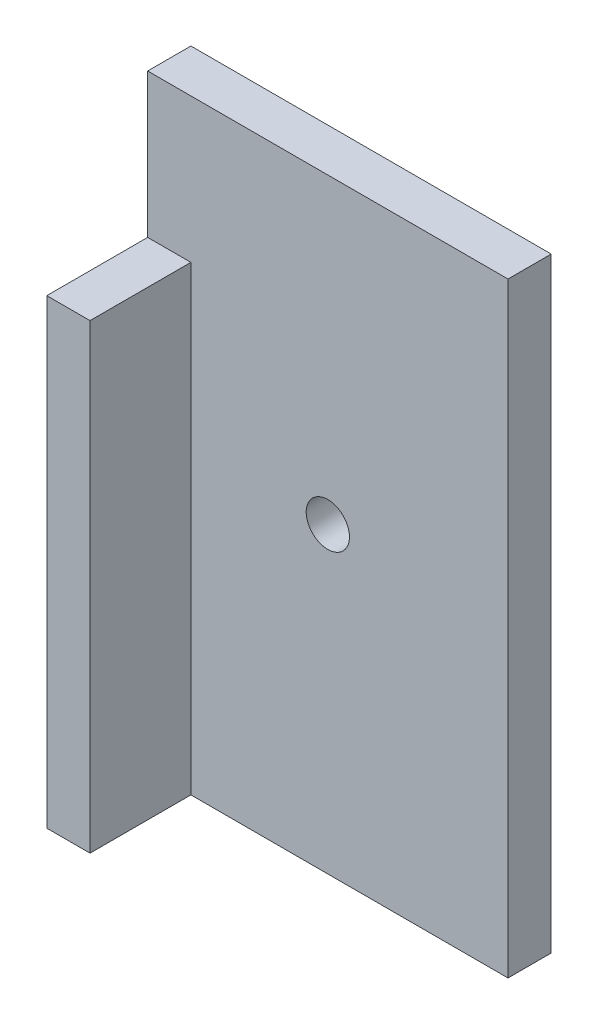
ISO-10303-21;
HEADER;
FILE_DESCRIPTION(('STEP AP214'),'2;1');
FILE_NAME('part.step','',(''),(''),'','','');
FILE_SCHEMA(('AUTOMOTIVE_DESIGN { 1 0 10303 214 1 1 1 1 }'));
ENDSEC;
DATA;
#1=APPLICATION_CONTEXT('core data for automotive mechanical design processes');
#2=APPLICATION_PROTOCOL_DEFINITION('international standard','automotive_design',2000,#1);
#3=PRODUCT_CONTEXT('',#1,'mechanical');
#4=PRODUCT('Part','Part','',(#3));
#5=PRODUCT_RELATED_PRODUCT_CATEGORY('part','',(#4));
#6=PRODUCT_DEFINITION_FORMATION('','',#4);
#7=PRODUCT_DEFINITION_CONTEXT('part definition',#1,'design');
#8=PRODUCT_DEFINITION('design','',#6,#7);
#9=PRODUCT_DEFINITION_SHAPE('','',#8);
#10=(LENGTH_UNIT() NAMED_UNIT(*) SI_UNIT(.MILLI.,.METRE.));
#11=(NAMED_UNIT(*) PLANE_ANGLE_UNIT() SI_UNIT($,.RADIAN.));
#12=(NAMED_UNIT(*) SI_UNIT($,.STERADIAN.) SOLID_ANGLE_UNIT());
#13=UNCERTAINTY_MEASURE_WITH_UNIT(LENGTH_MEASURE(1.E-05),#10,'distance_accuracy_value','');
#14=(GEOMETRIC_REPRESENTATION_CONTEXT(3) GLOBAL_UNCERTAINTY_ASSIGNED_CONTEXT((#13)) GLOBAL_UNIT_ASSIGNED_CONTEXT((#10,
#11,#12)) REPRESENTATION_CONTEXT('',''));
#15=CARTESIAN_POINT('',(0.,0.,0.));
#16=DIRECTION('',(0.,0.,1.));
#17=DIRECTION('',(1.,0.,0.));
#18=AXIS2_PLACEMENT_3D('',#15,#16,#17);
#19=CARTESIAN_POINT('',(0.,0.,3.));
#20=DIRECTION('',(0.,0.,1.));
#21=DIRECTION('',(1.,0.,0.));
#22=AXIS2_PLACEMENT_3D('',#19,#20,#21);
#23=PLANE('',#22);
#24=DIRECTION('',(0.,1.,0.));
#25=VECTOR('',#24,1.);
#26=CARTESIAN_POINT('',(-9.5,21.,3.));
#27=LINE('',#26,#25);
#28=CARTESIAN_POINT('',(-9.5,-21.,3.));
#29=VERTEX_POINT('',#28);
#30=CARTESIAN_POINT('',(-9.5,11.,3.));
#31=VERTEX_POINT('',#30);
#32=EDGE_CURVE('E63',#29,#31,#27,.T.);
#33=ORIENTED_EDGE('',*,*,#32,.F.);
#34=DIRECTION('',(1.,0.,0.));
#35=VECTOR('',#34,1.);
#36=CARTESIAN_POINT('',(-12.5,-21.,3.));
#37=LINE('',#36,#35);
#38=CARTESIAN_POINT('',(12.5,-21.,3.));
#39=VERTEX_POINT('',#38);
#40=EDGE_CURVE('E137',#29,#39,#37,.T.);
#41=ORIENTED_EDGE('',*,*,#40,.T.);
#42=DIRECTION('',(0.,1.,0.));
#43=VECTOR('',#42,1.);
#44=CARTESIAN_POINT('',(12.5,21.,3.));
#45=LINE('',#44,#43);
#46=CARTESIAN_POINT('',(12.5,21.,3.));
#47=VERTEX_POINT('',#46);
#48=EDGE_CURVE('E131',#39,#47,#45,.T.);
#49=ORIENTED_EDGE('',*,*,#48,.T.);
#50=DIRECTION('',(-1.,0.,0.));
#51=VECTOR('',#50,1.);
#52=CARTESIAN_POINT('',(-12.5,21.,3.));
#53=LINE('',#52,#51);
#54=CARTESIAN_POINT('',(-12.5,21.,3.));
#55=VERTEX_POINT('',#54);
#56=EDGE_CURVE('E134',#47,#55,#53,.T.);
#57=ORIENTED_EDGE('',*,*,#56,.T.);
#58=DIRECTION('',(0.,1.,0.));
#59=VECTOR('',#58,1.);
#60=CARTESIAN_POINT('',(-12.5,21.,3.));
#61=LINE('',#60,#59);
#62=CARTESIAN_POINT('',(-12.5,11.,3.));
#63=VERTEX_POINT('',#62);
#64=EDGE_CURVE('E123',#63,#55,#61,.T.);
#65=ORIENTED_EDGE('',*,*,#64,.F.);
#66=DIRECTION('',(1.,0.,0.));
#67=VECTOR('',#66,1.);
#68=CARTESIAN_POINT('',(-19.5,11.,3.));
#69=LINE('',#68,#67);
#70=EDGE_CURVE('E109',#63,#31,#69,.T.);
#71=ORIENTED_EDGE('',*,*,#70,.T.);
#72=EDGE_LOOP('',(#33,#41,#49,#57,#65,#71));
#73=FACE_BOUND('',#72,.T.);
#74=CARTESIAN_POINT('',(0.,0.,3.));
#75=DIRECTION('',(0.,0.,1.));
#76=DIRECTION('',(1.,0.,0.));
#77=AXIS2_PLACEMENT_3D('',#74,#75,#76);
#78=CIRCLE('',#77,1.5);
#79=CARTESIAN_POINT('',(1.5,0.,3.));
#80=VERTEX_POINT('',#79);
#81=EDGE_CURVE('E125',#80,#80,#78,.T.);
#82=ORIENTED_EDGE('',*,*,#81,.F.);
#83=EDGE_LOOP('',(#82));
#84=FACE_BOUND('',#83,.T.);
#85=ADVANCED_FACE('F41',(#73,#84),#23,.T.);
#86=CARTESIAN_POINT('',(0.,0.,0.));
#87=DIRECTION('',(0.,0.,1.));
#88=DIRECTION('',(1.,0.,0.));
#89=AXIS2_PLACEMENT_3D('',#86,#87,#88);
#90=PLANE('',#89);
#91=DIRECTION('',(0.,1.,0.));
#92=VECTOR('',#91,1.);
#93=CARTESIAN_POINT('',(12.5,21.,0.));
#94=LINE('',#93,#92);
#95=CARTESIAN_POINT('',(12.5,-21.,0.));
#96=VERTEX_POINT('',#95);
#97=CARTESIAN_POINT('',(12.5,21.,0.));
#98=VERTEX_POINT('',#97);
#99=EDGE_CURVE('E128',#96,#98,#94,.T.);
#100=ORIENTED_EDGE('',*,*,#99,.F.);
#101=DIRECTION('',(1.,0.,0.));
#102=VECTOR('',#101,1.);
#103=CARTESIAN_POINT('',(-12.5,-21.,0.));
#104=LINE('',#103,#102);
#105=CARTESIAN_POINT('',(-12.5,-21.,0.));
#106=VERTEX_POINT('',#105);
#107=EDGE_CURVE('E135',#106,#96,#104,.T.);
#108=ORIENTED_EDGE('',*,*,#107,.F.);
#109=DIRECTION('',(0.,-1.,0.));
#110=VECTOR('',#109,1.);
#111=CARTESIAN_POINT('',(-12.5,21.,0.));
#112=LINE('',#111,#110);
#113=CARTESIAN_POINT('',(-12.5,21.,0.));
#114=VERTEX_POINT('',#113);
#115=EDGE_CURVE('E145',#114,#106,#112,.T.);
#116=ORIENTED_EDGE('',*,*,#115,.F.);
#117=DIRECTION('',(-1.,0.,0.));
#118=VECTOR('',#117,1.);
#119=CARTESIAN_POINT('',(-12.5,21.,0.));
#120=LINE('',#119,#118);
#121=EDGE_CURVE('E142',#98,#114,#120,.T.);
#122=ORIENTED_EDGE('',*,*,#121,.F.);
#123=EDGE_LOOP('',(#100,#108,#116,#122));
#124=FACE_BOUND('',#123,.T.);
#125=CARTESIAN_POINT('',(0.,0.,0.));
#126=DIRECTION('',(0.,0.,1.));
#127=DIRECTION('',(1.,0.,0.));
#128=AXIS2_PLACEMENT_3D('',#125,#126,#127);
#129=CIRCLE('',#128,1.5);
#130=CARTESIAN_POINT('',(1.5,0.,0.));
#131=VERTEX_POINT('',#130);
#132=EDGE_CURVE('E117',#131,#131,#129,.T.);
#133=ORIENTED_EDGE('',*,*,#132,.T.);
#134=EDGE_LOOP('',(#133));
#135=FACE_BOUND('',#134,.T.);
#136=ADVANCED_FACE('F166',(#124,#135),#90,.F.);
#137=CARTESIAN_POINT('',(12.5,21.,3.));
#138=DIRECTION('',(-1.,0.,0.));
#139=DIRECTION('',(0.,-1.,0.));
#140=AXIS2_PLACEMENT_3D('',#137,#138,#139);
#141=PLANE('',#140);
#142=ORIENTED_EDGE('',*,*,#99,.T.);
#143=DIRECTION('',(0.,0.,-1.));
#144=VECTOR('',#143,1.);
#145=CARTESIAN_POINT('',(12.5,21.,3.));
#146=LINE('',#145,#144);
#147=EDGE_CURVE('E49',#47,#98,#146,.T.);
#148=ORIENTED_EDGE('',*,*,#147,.F.);
#149=ORIENTED_EDGE('',*,*,#48,.F.);
#150=DIRECTION('',(0.,0.,-1.));
#151=VECTOR('',#150,1.);
#152=CARTESIAN_POINT('',(12.5,-21.,3.));
#153=LINE('',#152,#151);
#154=EDGE_CURVE('E139',#39,#96,#153,.T.);
#155=ORIENTED_EDGE('',*,*,#154,.T.);
#156=EDGE_LOOP('',(#142,#148,#149,#155));
#157=FACE_BOUND('',#156,.T.);
#158=ADVANCED_FACE('F43',(#157),#141,.F.);
#159=CARTESIAN_POINT('',(-12.5,21.,3.));
#160=DIRECTION('',(0.,-1.,0.));
#161=DIRECTION('',(0.,0.,-1.));
#162=AXIS2_PLACEMENT_3D('',#159,#160,#161);
#163=PLANE('',#162);
#164=DIRECTION('',(0.,0.,-1.));
#165=VECTOR('',#164,1.);
#166=CARTESIAN_POINT('',(-12.5,21.,3.));
#167=LINE('',#166,#165);
#168=EDGE_CURVE('E153',#55,#114,#167,.T.);
#169=ORIENTED_EDGE('',*,*,#168,.F.);
#170=ORIENTED_EDGE('',*,*,#56,.F.);
#171=ORIENTED_EDGE('',*,*,#147,.T.);
#172=ORIENTED_EDGE('',*,*,#121,.T.);
#173=EDGE_LOOP('',(#169,#170,#171,#172));
#174=FACE_BOUND('',#173,.T.);
#175=ADVANCED_FACE('F158',(#174),#163,.F.);
#176=CARTESIAN_POINT('',(-12.5,21.,3.));
#177=DIRECTION('',(1.,0.,0.));
#178=DIRECTION('',(0.,0.,-1.));
#179=AXIS2_PLACEMENT_3D('',#176,#177,#178);
#180=PLANE('',#179);
#181=DIRECTION('',(0.,0.,-1.));
#182=VECTOR('',#181,1.);
#183=CARTESIAN_POINT('',(-12.5,11.,3.));
#184=LINE('',#183,#182);
#185=CARTESIAN_POINT('',(-12.5,11.,10.));
#186=VERTEX_POINT('',#185);
#187=EDGE_CURVE('E55',#186,#63,#184,.T.);
#188=ORIENTED_EDGE('',*,*,#187,.T.);
#189=ORIENTED_EDGE('',*,*,#64,.T.);
#190=ORIENTED_EDGE('',*,*,#168,.T.);
#191=ORIENTED_EDGE('',*,*,#115,.T.);
#192=DIRECTION('',(0.,0.,-1.));
#193=VECTOR('',#192,1.);
#194=CARTESIAN_POINT('',(-12.5,-21.,3.));
#195=LINE('',#194,#193);
#196=CARTESIAN_POINT('',(-12.5,-21.,10.));
#197=VERTEX_POINT('',#196);
#198=EDGE_CURVE('E150',#197,#106,#195,.T.);
#199=ORIENTED_EDGE('',*,*,#198,.F.);
#200=DIRECTION('',(0.,-1.,0.));
#201=VECTOR('',#200,1.);
#202=CARTESIAN_POINT('',(-12.5,21.,10.));
#203=LINE('',#202,#201);
#204=EDGE_CURVE('E119',#186,#197,#203,.T.);
#205=ORIENTED_EDGE('',*,*,#204,.F.);
#206=EDGE_LOOP('',(#188,#189,#190,#191,#199,#205));
#207=FACE_BOUND('',#206,.T.);
#208=ADVANCED_FACE('F170',(#207),#180,.F.);
#209=CARTESIAN_POINT('',(-12.5,-21.,3.));
#210=DIRECTION('',(0.,1.,0.));
#211=DIRECTION('',(0.,0.,1.));
#212=AXIS2_PLACEMENT_3D('',#209,#210,#211);
#213=PLANE('',#212);
#214=ORIENTED_EDGE('',*,*,#107,.T.);
#215=ORIENTED_EDGE('',*,*,#154,.F.);
#216=ORIENTED_EDGE('',*,*,#40,.F.);
#217=DIRECTION('',(0.,0.,-1.));
#218=VECTOR('',#217,1.);
#219=CARTESIAN_POINT('',(-9.5,-21.,10.));
#220=LINE('',#219,#218);
#221=CARTESIAN_POINT('',(-9.5,-21.,10.));
#222=VERTEX_POINT('',#221);
#223=EDGE_CURVE('E115',#222,#29,#220,.T.);
#224=ORIENTED_EDGE('',*,*,#223,.F.);
#225=DIRECTION('',(1.,0.,0.));
#226=VECTOR('',#225,1.);
#227=CARTESIAN_POINT('',(-12.5,-21.,10.));
#228=LINE('',#227,#226);
#229=EDGE_CURVE('E113',#197,#222,#228,.T.);
#230=ORIENTED_EDGE('',*,*,#229,.F.);
#231=ORIENTED_EDGE('',*,*,#198,.T.);
#232=EDGE_LOOP('',(#214,#215,#216,#224,#230,#231));
#233=FACE_BOUND('',#232,.T.);
#234=ADVANCED_FACE('F173',(#233),#213,.F.);
#235=CARTESIAN_POINT('',(0.,0.,3.));
#236=DIRECTION('',(0.,0.,-1.));
#237=DIRECTION('',(-1.,0.,0.));
#238=AXIS2_PLACEMENT_3D('',#235,#236,#237);
#239=CYLINDRICAL_SURFACE('',#238,1.5);
#240=ORIENTED_EDGE('',*,*,#81,.T.);
#241=EDGE_LOOP('',(#240));
#242=FACE_BOUND('',#241,.T.);
#243=ORIENTED_EDGE('',*,*,#132,.F.);
#244=EDGE_LOOP('',(#243));
#245=FACE_BOUND('',#244,.T.);
#246=ADVANCED_FACE('F182',(#242,#245),#239,.F.);
#247=CARTESIAN_POINT('',(-9.5,21.,10.));
#248=DIRECTION('',(-1.,0.,0.));
#249=DIRECTION('',(0.,-1.,0.));
#250=AXIS2_PLACEMENT_3D('',#247,#248,#249);
#251=PLANE('',#250);
#252=ORIENTED_EDGE('',*,*,#32,.T.);
#253=DIRECTION('',(0.,0.,-1.));
#254=VECTOR('',#253,1.);
#255=CARTESIAN_POINT('',(-9.5,11.,10.));
#256=LINE('',#255,#254);
#257=CARTESIAN_POINT('',(-9.5,11.,10.));
#258=VERTEX_POINT('',#257);
#259=EDGE_CURVE('E100',#258,#31,#256,.T.);
#260=ORIENTED_EDGE('',*,*,#259,.F.);
#261=DIRECTION('',(0.,1.,0.));
#262=VECTOR('',#261,1.);
#263=CARTESIAN_POINT('',(-9.5,21.,10.));
#264=LINE('',#263,#262);
#265=EDGE_CURVE('E108',#222,#258,#264,.T.);
#266=ORIENTED_EDGE('',*,*,#265,.F.);
#267=ORIENTED_EDGE('',*,*,#223,.T.);
#268=EDGE_LOOP('',(#252,#260,#266,#267));
#269=FACE_BOUND('',#268,.T.);
#270=ADVANCED_FACE('F106',(#269),#251,.F.);
#271=CARTESIAN_POINT('',(0.,0.,10.));
#272=DIRECTION('',(0.,0.,1.));
#273=DIRECTION('',(1.,0.,0.));
#274=AXIS2_PLACEMENT_3D('',#271,#272,#273);
#275=PLANE('',#274);
#276=DIRECTION('',(1.,0.,0.));
#277=VECTOR('',#276,1.);
#278=CARTESIAN_POINT('',(0.,11.,10.));
#279=LINE('',#278,#277);
#280=EDGE_CURVE('E11',#186,#258,#279,.T.);
#281=ORIENTED_EDGE('',*,*,#280,.F.);
#282=ORIENTED_EDGE('',*,*,#204,.T.);
#283=ORIENTED_EDGE('',*,*,#229,.T.);
#284=ORIENTED_EDGE('',*,*,#265,.T.);
#285=EDGE_LOOP('',(#281,#282,#283,#284));
#286=FACE_BOUND('',#285,.T.);
#287=ADVANCED_FACE('F111',(#286),#275,.T.);
#288=CARTESIAN_POINT('',(-19.5,11.,10.));
#289=DIRECTION('',(0.,-1.,0.));
#290=DIRECTION('',(0.,0.,-1.));
#291=AXIS2_PLACEMENT_3D('',#288,#289,#290);
#292=PLANE('',#291);
#293=ORIENTED_EDGE('',*,*,#280,.T.);
#294=ORIENTED_EDGE('',*,*,#259,.T.);
#295=ORIENTED_EDGE('',*,*,#70,.F.);
#296=ORIENTED_EDGE('',*,*,#187,.F.);
#297=EDGE_LOOP('',(#293,#294,#295,#296));
#298=FACE_BOUND('',#297,.T.);
#299=ADVANCED_FACE('F99',(#298),#292,.F.);
#300=CLOSED_SHELL('',(#85,#136,#158,#175,#208,#234,#246,#270,#287,#299));
#301=MANIFOLD_SOLID_BREP('B2',#300);
#302=ADVANCED_BREP_SHAPE_REPRESENTATION('',(#18,#301),#14);
#303=SHAPE_DEFINITION_REPRESENTATION(#9,#302);
ENDSEC;
END-ISO-10303-21;
